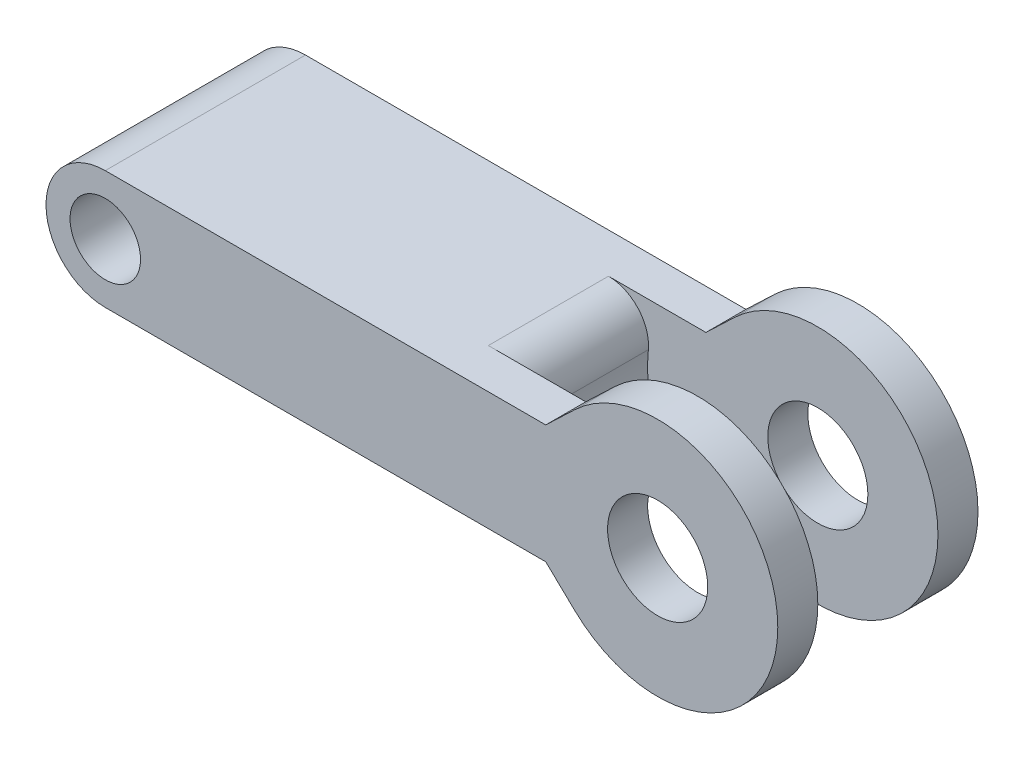
ISO-10303-21;
HEADER;
FILE_DESCRIPTION(('STEP AP214'),'2;1');
FILE_NAME('part.step','',(''),(''),'','','');
FILE_SCHEMA(('AUTOMOTIVE_DESIGN { 1 0 10303 214 1 1 1 1 }'));
ENDSEC;
DATA;
#1=APPLICATION_CONTEXT('core data for automotive mechanical design processes');
#2=APPLICATION_PROTOCOL_DEFINITION('international standard','automotive_design',2000,#1);
#3=PRODUCT_CONTEXT('',#1,'mechanical');
#4=PRODUCT('Part','Part','',(#3));
#5=PRODUCT_RELATED_PRODUCT_CATEGORY('part','',(#4));
#6=PRODUCT_DEFINITION_FORMATION('','',#4);
#7=PRODUCT_DEFINITION_CONTEXT('part definition',#1,'design');
#8=PRODUCT_DEFINITION('design','',#6,#7);
#9=PRODUCT_DEFINITION_SHAPE('','',#8);
#10=(LENGTH_UNIT() NAMED_UNIT(*) SI_UNIT(.MILLI.,.METRE.));
#11=(NAMED_UNIT(*) PLANE_ANGLE_UNIT() SI_UNIT($,.RADIAN.));
#12=(NAMED_UNIT(*) SI_UNIT($,.STERADIAN.) SOLID_ANGLE_UNIT());
#13=UNCERTAINTY_MEASURE_WITH_UNIT(LENGTH_MEASURE(1.E-05),#10,'distance_accuracy_value','');
#14=(GEOMETRIC_REPRESENTATION_CONTEXT(3) GLOBAL_UNCERTAINTY_ASSIGNED_CONTEXT((#13)) GLOBAL_UNIT_ASSIGNED_CONTEXT((#10,
#11,#12)) REPRESENTATION_CONTEXT('',''));
#15=CARTESIAN_POINT('',(0.,0.,0.));
#16=DIRECTION('',(0.,0.,1.));
#17=DIRECTION('',(1.,0.,0.));
#18=AXIS2_PLACEMENT_3D('',#15,#16,#17);
#19=CARTESIAN_POINT('',(-4.14221908071607,4.34073969357202,-5.));
#20=DIRECTION('',(0.690369846786012,-0.723456615595337,0.));
#21=DIRECTION('',(0.723456615595337,0.690369846786012,0.));
#22=AXIS2_PLACEMENT_3D('',#19,#20,#21);
#23=PLANE('',#22);
#24=DIRECTION('',(-0.723456615595337,-0.690369846786012,0.));
#25=VECTOR('',#24,1.);
#26=CARTESIAN_POINT('',(-4.14221908071607,4.34073969357202,-3.));
#27=LINE('',#26,#25);
#28=CARTESIAN_POINT('',(-4.14221908071607,4.34073969357202,-3.));
#29=VERTEX_POINT('',#28);
#30=CARTESIAN_POINT('',(-5.58913231190674,2.96,-3.));
#31=VERTEX_POINT('',#30);
#32=EDGE_CURVE('E207',#29,#31,#27,.T.);
#33=ORIENTED_EDGE('',*,*,#32,.F.);
#34=DIRECTION('',(0.,0.,1.));
#35=VECTOR('',#34,1.);
#36=CARTESIAN_POINT('',(-4.14221908071607,4.34073969357202,-5.));
#37=LINE('',#36,#35);
#38=CARTESIAN_POINT('',(-4.14221908071607,4.34073969357202,-5.));
#39=VERTEX_POINT('',#38);
#40=EDGE_CURVE('E264',#39,#29,#37,.T.);
#41=ORIENTED_EDGE('',*,*,#40,.F.);
#42=DIRECTION('',(0.723456615595337,0.690369846786012,0.));
#43=VECTOR('',#42,1.);
#44=CARTESIAN_POINT('',(-4.14221908071607,4.34073969357202,-5.));
#45=LINE('',#44,#43);
#46=CARTESIAN_POINT('',(-5.58913231190674,2.96,-5.));
#47=VERTEX_POINT('',#46);
#48=EDGE_CURVE('E258',#47,#39,#45,.T.);
#49=ORIENTED_EDGE('',*,*,#48,.F.);
#50=DIRECTION('',(0.,0.,1.));
#51=VECTOR('',#50,1.);
#52=CARTESIAN_POINT('',(-5.58913231190674,2.96,-5.));
#53=LINE('',#52,#51);
#54=EDGE_CURVE('E167',#47,#31,#53,.T.);
#55=ORIENTED_EDGE('',*,*,#54,.T.);
#56=EDGE_LOOP('',(#33,#41,#49,#55));
#57=FACE_BOUND('',#56,.T.);
#58=ADVANCED_FACE('F32',(#57),#23,.F.);
#59=CARTESIAN_POINT('',(0.,0.,-5.));
#60=DIRECTION('',(0.,0.,1.));
#61=DIRECTION('',(1.,0.,0.));
#62=AXIS2_PLACEMENT_3D('',#59,#60,#61);
#63=CYLINDRICAL_SURFACE('',#62,6.);
#64=CARTESIAN_POINT('',(0.,0.,-3.));
#65=DIRECTION('',(0.,0.,1.));
#66=DIRECTION('',(1.,0.,0.));
#67=AXIS2_PLACEMENT_3D('',#64,#65,#66);
#68=CIRCLE('',#67,6.);
#69=CARTESIAN_POINT('',(-4.14221908071606,-4.34073969357203,-3.));
#70=VERTEX_POINT('',#69);
#71=EDGE_CURVE('E147',#70,#29,#68,.T.);
#72=ORIENTED_EDGE('',*,*,#71,.F.);
#73=DIRECTION('',(0.,0.,1.));
#74=VECTOR('',#73,1.);
#75=CARTESIAN_POINT('',(-4.14221908071606,-4.34073969357203,-5.));
#76=LINE('',#75,#74);
#77=CARTESIAN_POINT('',(-4.14221908071606,-4.34073969357203,-5.));
#78=VERTEX_POINT('',#77);
#79=EDGE_CURVE('E146',#78,#70,#76,.T.);
#80=ORIENTED_EDGE('',*,*,#79,.F.);
#81=CARTESIAN_POINT('',(0.,0.,-5.));
#82=DIRECTION('',(0.,0.,1.));
#83=DIRECTION('',(1.,0.,0.));
#84=AXIS2_PLACEMENT_3D('',#81,#82,#83);
#85=CIRCLE('',#84,6.);
#86=EDGE_CURVE('E256',#39,#78,#85,.F.);
#87=ORIENTED_EDGE('',*,*,#86,.F.);
#88=ORIENTED_EDGE('',*,*,#40,.T.);
#89=EDGE_LOOP('',(#72,#80,#87,#88));
#90=FACE_BOUND('',#89,.T.);
#91=ADVANCED_FACE('F302',(#90),#63,.T.);
#92=CARTESIAN_POINT('',(-4.14221908071608,-4.34073969357202,-5.));
#93=DIRECTION('',(0.690369846786013,0.723456615595336,0.));
#94=DIRECTION('',(-0.723456615595336,0.690369846786013,0.));
#95=AXIS2_PLACEMENT_3D('',#92,#93,#94);
#96=PLANE('',#95);
#97=DIRECTION('',(0.723456615595336,-0.690369846786013,0.));
#98=VECTOR('',#97,1.);
#99=CARTESIAN_POINT('',(-4.14221908071608,-4.34073969357202,-3.));
#100=LINE('',#99,#98);
#101=CARTESIAN_POINT('',(-5.58913231190674,-2.96,-3.));
#102=VERTEX_POINT('',#101);
#103=EDGE_CURVE('E132',#102,#70,#100,.T.);
#104=ORIENTED_EDGE('',*,*,#103,.F.);
#105=DIRECTION('',(0.,0.,1.));
#106=VECTOR('',#105,1.);
#107=CARTESIAN_POINT('',(-5.58913231190674,-2.96,-5.));
#108=LINE('',#107,#106);
#109=CARTESIAN_POINT('',(-5.58913231190674,-2.96,-5.));
#110=VERTEX_POINT('',#109);
#111=EDGE_CURVE('E143',#110,#102,#108,.T.);
#112=ORIENTED_EDGE('',*,*,#111,.F.);
#113=DIRECTION('',(-0.723456615595336,0.690369846786013,0.));
#114=VECTOR('',#113,1.);
#115=CARTESIAN_POINT('',(-4.14221908071608,-4.34073969357202,-5.));
#116=LINE('',#115,#114);
#117=EDGE_CURVE('E254',#78,#110,#116,.T.);
#118=ORIENTED_EDGE('',*,*,#117,.F.);
#119=ORIENTED_EDGE('',*,*,#79,.T.);
#120=EDGE_LOOP('',(#104,#112,#118,#119));
#121=FACE_BOUND('',#120,.T.);
#122=ADVANCED_FACE('F141',(#121),#96,.F.);
#123=CARTESIAN_POINT('',(0.,0.,-5.));
#124=DIRECTION('',(0.,0.,1.));
#125=DIRECTION('',(1.,0.,0.));
#126=AXIS2_PLACEMENT_3D('',#123,#124,#125);
#127=CYLINDRICAL_SURFACE('',#126,2.5);
#128=CARTESIAN_POINT('',(0.,0.,-5.));
#129=DIRECTION('',(0.,0.,1.));
#130=DIRECTION('',(1.,0.,0.));
#131=AXIS2_PLACEMENT_3D('',#128,#129,#130);
#132=CIRCLE('',#131,2.5);
#133=CARTESIAN_POINT('',(2.5,0.,-5.));
#134=VERTEX_POINT('',#133);
#135=EDGE_CURVE('E162',#134,#134,#132,.T.);
#136=ORIENTED_EDGE('',*,*,#135,.F.);
#137=EDGE_LOOP('',(#136));
#138=FACE_BOUND('',#137,.T.);
#139=CARTESIAN_POINT('',(0.,0.,-3.));
#140=DIRECTION('',(0.,0.,1.));
#141=DIRECTION('',(1.,0.,0.));
#142=AXIS2_PLACEMENT_3D('',#139,#140,#141);
#143=CIRCLE('',#142,2.5);
#144=CARTESIAN_POINT('',(2.5,0.,-3.));
#145=VERTEX_POINT('',#144);
#146=EDGE_CURVE('E192',#145,#145,#143,.T.);
#147=ORIENTED_EDGE('',*,*,#146,.T.);
#148=EDGE_LOOP('',(#147));
#149=FACE_BOUND('',#148,.T.);
#150=ADVANCED_FACE('F304',(#138,#149),#127,.F.);
#151=CARTESIAN_POINT('',(0.,2.96,-5.));
#152=DIRECTION('',(0.,-1.,0.));
#153=DIRECTION('',(0.,0.,-1.));
#154=AXIS2_PLACEMENT_3D('',#151,#152,#153);
#155=PLANE('',#154);
#156=DIRECTION('',(-1.,0.,0.));
#157=VECTOR('',#156,1.);
#158=CARTESIAN_POINT('',(0.,2.96,3.));
#159=LINE('',#158,#157);
#160=CARTESIAN_POINT('',(-5.58913231190674,2.96,3.));
#161=VERTEX_POINT('',#160);
#162=CARTESIAN_POINT('',(-10.4560221881937,2.96,3.));
#163=VERTEX_POINT('',#162);
#164=EDGE_CURVE('E196',#161,#163,#159,.T.);
#165=ORIENTED_EDGE('',*,*,#164,.T.);
#166=DIRECTION('',(0.,0.,1.));
#167=VECTOR('',#166,1.);
#168=CARTESIAN_POINT('',(-10.4560221881937,2.96,-3.));
#169=LINE('',#168,#167);
#170=CARTESIAN_POINT('',(-10.4560221881937,2.96,-3.));
#171=VERTEX_POINT('',#170);
#172=EDGE_CURVE('E170',#163,#171,#169,.F.);
#173=ORIENTED_EDGE('',*,*,#172,.T.);
#174=DIRECTION('',(-1.,0.,0.));
#175=VECTOR('',#174,1.);
#176=CARTESIAN_POINT('',(0.,2.96,-3.));
#177=LINE('',#176,#175);
#178=EDGE_CURVE('E183',#31,#171,#177,.T.);
#179=ORIENTED_EDGE('',*,*,#178,.F.);
#180=ORIENTED_EDGE('',*,*,#54,.F.);
#181=DIRECTION('',(1.,0.,0.));
#182=VECTOR('',#181,1.);
#183=CARTESIAN_POINT('',(0.,2.96,-5.));
#184=LINE('',#183,#182);
#185=CARTESIAN_POINT('',(-27.5891323119067,2.96,-5.));
#186=VERTEX_POINT('',#185);
#187=EDGE_CURVE('E247',#186,#47,#184,.T.);
#188=ORIENTED_EDGE('',*,*,#187,.F.);
#189=DIRECTION('',(0.,0.,1.));
#190=VECTOR('',#189,1.);
#191=CARTESIAN_POINT('',(-27.5891323119067,2.96,-5.));
#192=LINE('',#191,#190);
#193=CARTESIAN_POINT('',(-27.5891323119067,2.96,5.));
#194=VERTEX_POINT('',#193);
#195=EDGE_CURVE('E160',#186,#194,#192,.T.);
#196=ORIENTED_EDGE('',*,*,#195,.T.);
#197=DIRECTION('',(1.,0.,0.));
#198=VECTOR('',#197,1.);
#199=CARTESIAN_POINT('',(0.,2.96,5.));
#200=LINE('',#199,#198);
#201=CARTESIAN_POINT('',(-5.58913231190674,2.96,5.));
#202=VERTEX_POINT('',#201);
#203=EDGE_CURVE('E223',#194,#202,#200,.T.);
#204=ORIENTED_EDGE('',*,*,#203,.T.);
#205=EDGE_CURVE('E263',#161,#202,#53,.T.);
#206=ORIENTED_EDGE('',*,*,#205,.F.);
#207=EDGE_LOOP('',(#165,#173,#179,#180,#188,#196,#204,#206));
#208=FACE_BOUND('',#207,.T.);
#209=ADVANCED_FACE('F286',(#208),#155,.F.);
#210=CARTESIAN_POINT('',(-4.14221908071607,4.34073969357202,3.));
#211=VERTEX_POINT('',#210);
#212=CARTESIAN_POINT('',(-4.14221908071607,4.34073969357202,5.));
#213=VERTEX_POINT('',#212);
#214=EDGE_CURVE('E266',#211,#213,#37,.T.);
#215=ORIENTED_EDGE('',*,*,#214,.F.);
#216=DIRECTION('',(-0.723456615595337,-0.690369846786012,0.));
#217=VECTOR('',#216,1.);
#218=CARTESIAN_POINT('',(-4.14221908071607,4.34073969357202,3.));
#219=LINE('',#218,#217);
#220=EDGE_CURVE('E217',#211,#161,#219,.T.);
#221=ORIENTED_EDGE('',*,*,#220,.T.);
#222=ORIENTED_EDGE('',*,*,#205,.T.);
#223=DIRECTION('',(0.723456615595337,0.690369846786012,0.));
#224=VECTOR('',#223,1.);
#225=CARTESIAN_POINT('',(-4.14221908071607,4.34073969357202,5.));
#226=LINE('',#225,#224);
#227=EDGE_CURVE('E238',#202,#213,#226,.T.);
#228=ORIENTED_EDGE('',*,*,#227,.T.);
#229=EDGE_LOOP('',(#215,#221,#222,#228));
#230=FACE_BOUND('',#229,.T.);
#231=ADVANCED_FACE('F283',(#230),#23,.F.);
#232=CARTESIAN_POINT('',(-4.14221908071606,-4.34073969357203,3.));
#233=VERTEX_POINT('',#232);
#234=CARTESIAN_POINT('',(-4.14221908071606,-4.34073969357203,5.));
#235=VERTEX_POINT('',#234);
#236=EDGE_CURVE('E152',#233,#235,#76,.T.);
#237=ORIENTED_EDGE('',*,*,#236,.F.);
#238=CARTESIAN_POINT('',(0.,0.,3.));
#239=DIRECTION('',(0.,0.,1.));
#240=DIRECTION('',(1.,0.,0.));
#241=AXIS2_PLACEMENT_3D('',#238,#239,#240);
#242=CIRCLE('',#241,6.);
#243=EDGE_CURVE('E214',#233,#211,#242,.T.);
#244=ORIENTED_EDGE('',*,*,#243,.T.);
#245=ORIENTED_EDGE('',*,*,#214,.T.);
#246=CARTESIAN_POINT('',(0.,0.,5.));
#247=DIRECTION('',(0.,0.,1.));
#248=DIRECTION('',(1.,0.,0.));
#249=AXIS2_PLACEMENT_3D('',#246,#247,#248);
#250=CIRCLE('',#249,6.);
#251=EDGE_CURVE('E235',#213,#235,#250,.F.);
#252=ORIENTED_EDGE('',*,*,#251,.T.);
#253=EDGE_LOOP('',(#237,#244,#245,#252));
#254=FACE_BOUND('',#253,.T.);
#255=ADVANCED_FACE('F274',(#254),#63,.T.);
#256=CARTESIAN_POINT('',(-5.58913231190674,-2.96,3.));
#257=VERTEX_POINT('',#256);
#258=CARTESIAN_POINT('',(-5.58913231190674,-2.96,5.));
#259=VERTEX_POINT('',#258);
#260=EDGE_CURVE('E153',#257,#259,#108,.T.);
#261=ORIENTED_EDGE('',*,*,#260,.F.);
#262=DIRECTION('',(0.723456615595336,-0.690369846786013,0.));
#263=VECTOR('',#262,1.);
#264=CARTESIAN_POINT('',(-4.14221908071608,-4.34073969357202,3.));
#265=LINE('',#264,#263);
#266=EDGE_CURVE('E211',#257,#233,#265,.T.);
#267=ORIENTED_EDGE('',*,*,#266,.T.);
#268=ORIENTED_EDGE('',*,*,#236,.T.);
#269=DIRECTION('',(-0.723456615595336,0.690369846786013,0.));
#270=VECTOR('',#269,1.);
#271=CARTESIAN_POINT('',(-4.14221908071608,-4.34073969357202,5.));
#272=LINE('',#271,#270);
#273=EDGE_CURVE('E232',#235,#259,#272,.T.);
#274=ORIENTED_EDGE('',*,*,#273,.T.);
#275=EDGE_LOOP('',(#261,#267,#268,#274));
#276=FACE_BOUND('',#275,.T.);
#277=ADVANCED_FACE('F292',(#276),#96,.F.);
#278=CARTESIAN_POINT('',(0.,-2.96,-5.));
#279=DIRECTION('',(0.,1.,0.));
#280=DIRECTION('',(-1.,0.,0.));
#281=AXIS2_PLACEMENT_3D('',#278,#279,#280);
#282=PLANE('',#281);
#283=DIRECTION('',(1.,0.,0.));
#284=VECTOR('',#283,1.);
#285=CARTESIAN_POINT('',(0.,-2.96,-3.));
#286=LINE('',#285,#284);
#287=CARTESIAN_POINT('',(-10.4560221881938,-2.96,-3.));
#288=VERTEX_POINT('',#287);
#289=EDGE_CURVE('E47',#288,#102,#286,.T.);
#290=ORIENTED_EDGE('',*,*,#289,.F.);
#291=DIRECTION('',(0.,0.,1.));
#292=VECTOR('',#291,1.);
#293=CARTESIAN_POINT('',(-10.4560221881938,-2.96,3.));
#294=LINE('',#293,#292);
#295=CARTESIAN_POINT('',(-10.4560221881938,-2.96,3.));
#296=VERTEX_POINT('',#295);
#297=EDGE_CURVE('E173',#288,#296,#294,.T.);
#298=ORIENTED_EDGE('',*,*,#297,.T.);
#299=DIRECTION('',(1.,0.,0.));
#300=VECTOR('',#299,1.);
#301=CARTESIAN_POINT('',(0.,-2.96,3.));
#302=LINE('',#301,#300);
#303=EDGE_CURVE('E54',#296,#257,#302,.T.);
#304=ORIENTED_EDGE('',*,*,#303,.T.);
#305=ORIENTED_EDGE('',*,*,#260,.T.);
#306=DIRECTION('',(-1.,0.,0.));
#307=VECTOR('',#306,1.);
#308=CARTESIAN_POINT('',(0.,-2.96,5.));
#309=LINE('',#308,#307);
#310=CARTESIAN_POINT('',(-27.5891323119067,-2.96,5.));
#311=VERTEX_POINT('',#310);
#312=EDGE_CURVE('E229',#259,#311,#309,.T.);
#313=ORIENTED_EDGE('',*,*,#312,.T.);
#314=DIRECTION('',(0.,0.,1.));
#315=VECTOR('',#314,1.);
#316=CARTESIAN_POINT('',(-27.5891323119067,-2.96,-5.));
#317=LINE('',#316,#315);
#318=CARTESIAN_POINT('',(-27.5891323119067,-2.96,-5.));
#319=VERTEX_POINT('',#318);
#320=EDGE_CURVE('E156',#319,#311,#317,.T.);
#321=ORIENTED_EDGE('',*,*,#320,.F.);
#322=DIRECTION('',(-1.,0.,0.));
#323=VECTOR('',#322,1.);
#324=CARTESIAN_POINT('',(0.,-2.96,-5.));
#325=LINE('',#324,#323);
#326=EDGE_CURVE('E151',#110,#319,#325,.T.);
#327=ORIENTED_EDGE('',*,*,#326,.F.);
#328=ORIENTED_EDGE('',*,*,#111,.T.);
#329=EDGE_LOOP('',(#290,#298,#304,#305,#313,#321,#327,#328));
#330=FACE_BOUND('',#329,.T.);
#331=ADVANCED_FACE('F149',(#330),#282,.F.);
#332=CARTESIAN_POINT('',(-27.5891323119067,0.,-5.));
#333=DIRECTION('',(0.,0.,1.));
#334=DIRECTION('',(1.,0.,0.));
#335=AXIS2_PLACEMENT_3D('',#332,#333,#334);
#336=CYLINDRICAL_SURFACE('',#335,2.96);
#337=ORIENTED_EDGE('',*,*,#320,.T.);
#338=CARTESIAN_POINT('',(-27.5891323119067,0.,5.));
#339=DIRECTION('',(0.,0.,1.));
#340=DIRECTION('',(1.,0.,0.));
#341=AXIS2_PLACEMENT_3D('',#338,#339,#340);
#342=CIRCLE('',#341,2.96);
#343=EDGE_CURVE('E226',#194,#311,#342,.T.);
#344=ORIENTED_EDGE('',*,*,#343,.F.);
#345=ORIENTED_EDGE('',*,*,#195,.F.);
#346=CARTESIAN_POINT('',(-27.5891323119067,0.,-5.));
#347=DIRECTION('',(0.,0.,1.));
#348=DIRECTION('',(1.,0.,0.));
#349=AXIS2_PLACEMENT_3D('',#346,#347,#348);
#350=CIRCLE('',#349,2.96);
#351=EDGE_CURVE('E250',#186,#319,#350,.T.);
#352=ORIENTED_EDGE('',*,*,#351,.T.);
#353=EDGE_LOOP('',(#337,#344,#345,#352));
#354=FACE_BOUND('',#353,.T.);
#355=ADVANCED_FACE('F299',(#354),#336,.T.);
#356=CARTESIAN_POINT('',(-27.5891323119067,0.,-5.));
#357=DIRECTION('',(0.,0.,1.));
#358=DIRECTION('',(1.,0.,0.));
#359=AXIS2_PLACEMENT_3D('',#356,#357,#358);
#360=CYLINDRICAL_SURFACE('',#359,1.76);
#361=CARTESIAN_POINT('',(-27.5891323119067,0.,-5.));
#362=DIRECTION('',(0.,0.,1.));
#363=DIRECTION('',(1.,0.,0.));
#364=AXIS2_PLACEMENT_3D('',#361,#362,#363);
#365=CIRCLE('',#364,1.76);
#366=CARTESIAN_POINT('',(-25.8291323119067,0.,-5.));
#367=VERTEX_POINT('',#366);
#368=EDGE_CURVE('E244',#367,#367,#365,.T.);
#369=ORIENTED_EDGE('',*,*,#368,.F.);
#370=EDGE_LOOP('',(#369));
#371=FACE_BOUND('',#370,.T.);
#372=CARTESIAN_POINT('',(-27.5891323119067,0.,5.));
#373=DIRECTION('',(0.,0.,1.));
#374=DIRECTION('',(1.,0.,0.));
#375=AXIS2_PLACEMENT_3D('',#372,#373,#374);
#376=CIRCLE('',#375,1.76);
#377=CARTESIAN_POINT('',(-25.8291323119067,0.,5.));
#378=VERTEX_POINT('',#377);
#379=EDGE_CURVE('E220',#378,#378,#376,.T.);
#380=ORIENTED_EDGE('',*,*,#379,.T.);
#381=EDGE_LOOP('',(#380));
#382=FACE_BOUND('',#381,.T.);
#383=ADVANCED_FACE('F325',(#371,#382),#360,.F.);
#384=CARTESIAN_POINT('',(0.,0.,3.));
#385=DIRECTION('',(0.,0.,1.));
#386=DIRECTION('',(1.,0.,0.));
#387=AXIS2_PLACEMENT_3D('',#384,#385,#386);
#388=CIRCLE('',#387,2.5);
#389=CARTESIAN_POINT('',(2.5,0.,3.));
#390=VERTEX_POINT('',#389);
#391=EDGE_CURVE('E136',#390,#390,#388,.T.);
#392=ORIENTED_EDGE('',*,*,#391,.F.);
#393=EDGE_LOOP('',(#392));
#394=FACE_BOUND('',#393,.T.);
#395=CARTESIAN_POINT('',(0.,0.,5.));
#396=DIRECTION('',(0.,0.,1.));
#397=DIRECTION('',(1.,0.,0.));
#398=AXIS2_PLACEMENT_3D('',#395,#396,#397);
#399=CIRCLE('',#398,2.5);
#400=CARTESIAN_POINT('',(2.5,0.,5.));
#401=VERTEX_POINT('',#400);
#402=EDGE_CURVE('E241',#401,#401,#399,.T.);
#403=ORIENTED_EDGE('',*,*,#402,.T.);
#404=EDGE_LOOP('',(#403));
#405=FACE_BOUND('',#404,.T.);
#406=ADVANCED_FACE('F322',(#394,#405),#127,.F.);
#407=CARTESIAN_POINT('',(0.,0.,-5.));
#408=DIRECTION('',(0.,0.,1.));
#409=DIRECTION('',(1.,0.,0.));
#410=AXIS2_PLACEMENT_3D('',#407,#408,#409);
#411=PLANE('',#410);
#412=ORIENTED_EDGE('',*,*,#368,.T.);
#413=EDGE_LOOP('',(#412));
#414=FACE_BOUND('',#413,.T.);
#415=ORIENTED_EDGE('',*,*,#187,.T.);
#416=ORIENTED_EDGE('',*,*,#48,.T.);
#417=ORIENTED_EDGE('',*,*,#86,.T.);
#418=ORIENTED_EDGE('',*,*,#117,.T.);
#419=ORIENTED_EDGE('',*,*,#326,.T.);
#420=ORIENTED_EDGE('',*,*,#351,.F.);
#421=EDGE_LOOP('',(#415,#416,#417,#418,#419,#420));
#422=FACE_BOUND('',#421,.T.);
#423=ORIENTED_EDGE('',*,*,#135,.T.);
#424=EDGE_LOOP('',(#423));
#425=FACE_BOUND('',#424,.T.);
#426=ADVANCED_FACE('F347',(#414,#422,#425),#411,.F.);
#427=CARTESIAN_POINT('',(0.,0.,5.));
#428=DIRECTION('',(0.,0.,1.));
#429=DIRECTION('',(1.,0.,0.));
#430=AXIS2_PLACEMENT_3D('',#427,#428,#429);
#431=PLANE('',#430);
#432=ORIENTED_EDGE('',*,*,#379,.F.);
#433=EDGE_LOOP('',(#432));
#434=FACE_BOUND('',#433,.T.);
#435=ORIENTED_EDGE('',*,*,#203,.F.);
#436=ORIENTED_EDGE('',*,*,#343,.T.);
#437=ORIENTED_EDGE('',*,*,#312,.F.);
#438=ORIENTED_EDGE('',*,*,#273,.F.);
#439=ORIENTED_EDGE('',*,*,#251,.F.);
#440=ORIENTED_EDGE('',*,*,#227,.F.);
#441=EDGE_LOOP('',(#435,#436,#437,#438,#439,#440));
#442=FACE_BOUND('',#441,.T.);
#443=ORIENTED_EDGE('',*,*,#402,.F.);
#444=EDGE_LOOP('',(#443));
#445=FACE_BOUND('',#444,.T.);
#446=ADVANCED_FACE('F280',(#434,#442,#445),#431,.T.);
#447=CARTESIAN_POINT('',(0.,0.,3.));
#448=DIRECTION('',(0.,0.,-1.));
#449=DIRECTION('',(-1.,0.,0.));
#450=AXIS2_PLACEMENT_3D('',#447,#448,#449);
#451=CYLINDRICAL_SURFACE('',#450,8.5);
#452=CARTESIAN_POINT('',(0.,0.,-3.));
#453=DIRECTION('',(0.,0.,1.));
#454=DIRECTION('',(1.,0.,0.));
#455=AXIS2_PLACEMENT_3D('',#452,#453,#454);
#456=CIRCLE('',#455,8.5);
#457=CARTESIAN_POINT('',(-8.46439891425208,0.777142857142857,-3.));
#458=VERTEX_POINT('',#457);
#459=CARTESIAN_POINT('',(-8.46439891425208,-0.777142857142855,-3.));
#460=VERTEX_POINT('',#459);
#461=EDGE_CURVE('E181',#458,#460,#456,.T.);
#462=ORIENTED_EDGE('',*,*,#461,.F.);
#463=DIRECTION('',(0.,0.,-1.));
#464=VECTOR('',#463,1.);
#465=CARTESIAN_POINT('',(-8.46439891425208,0.777142857142857,3.));
#466=LINE('',#465,#464);
#467=CARTESIAN_POINT('',(-8.46439891425208,0.777142857142857,3.));
#468=VERTEX_POINT('',#467);
#469=EDGE_CURVE('E166',#458,#468,#466,.F.);
#470=ORIENTED_EDGE('',*,*,#469,.T.);
#471=CARTESIAN_POINT('',(0.,0.,3.));
#472=DIRECTION('',(0.,0.,1.));
#473=DIRECTION('',(1.,0.,0.));
#474=AXIS2_PLACEMENT_3D('',#471,#472,#473);
#475=CIRCLE('',#474,8.5);
#476=CARTESIAN_POINT('',(-8.46439891425208,-0.777142857142855,3.));
#477=VERTEX_POINT('',#476);
#478=EDGE_CURVE('E198',#468,#477,#475,.T.);
#479=ORIENTED_EDGE('',*,*,#478,.T.);
#480=DIRECTION('',(0.,0.,-1.));
#481=VECTOR('',#480,1.);
#482=CARTESIAN_POINT('',(-8.46439891425208,-0.777142857142855,3.));
#483=LINE('',#482,#481);
#484=EDGE_CURVE('E163',#477,#460,#483,.T.);
#485=ORIENTED_EDGE('',*,*,#484,.T.);
#486=EDGE_LOOP('',(#462,#470,#479,#485));
#487=FACE_BOUND('',#486,.T.);
#488=ADVANCED_FACE('F188',(#487),#451,.F.);
#489=CARTESIAN_POINT('',(0.,0.,3.));
#490=DIRECTION('',(0.,0.,1.));
#491=DIRECTION('',(1.,0.,0.));
#492=AXIS2_PLACEMENT_3D('',#489,#490,#491);
#493=PLANE('',#492);
#494=ORIENTED_EDGE('',*,*,#391,.T.);
#495=EDGE_LOOP('',(#494));
#496=FACE_BOUND('',#495,.T.);
#497=ORIENTED_EDGE('',*,*,#220,.F.);
#498=ORIENTED_EDGE('',*,*,#243,.F.);
#499=ORIENTED_EDGE('',*,*,#266,.F.);
#500=ORIENTED_EDGE('',*,*,#303,.F.);
#501=CARTESIAN_POINT('',(-10.4560221881938,-0.959999999999998,3.));
#502=DIRECTION('',(0.,0.,1.));
#503=DIRECTION('',(1.,0.,0.));
#504=AXIS2_PLACEMENT_3D('',#501,#502,#503);
#505=CIRCLE('',#504,2.);
#506=EDGE_CURVE('E11',#296,#477,#505,.T.);
#507=ORIENTED_EDGE('',*,*,#506,.T.);
#508=ORIENTED_EDGE('',*,*,#478,.F.);
#509=CARTESIAN_POINT('',(-10.4560221881937,0.96,3.));
#510=DIRECTION('',(0.,0.,1.));
#511=DIRECTION('',(1.,0.,0.));
#512=AXIS2_PLACEMENT_3D('',#509,#510,#511);
#513=CIRCLE('',#512,2.);
#514=EDGE_CURVE('E175',#468,#163,#513,.T.);
#515=ORIENTED_EDGE('',*,*,#514,.T.);
#516=ORIENTED_EDGE('',*,*,#164,.F.);
#517=EDGE_LOOP('',(#497,#498,#499,#500,#507,#508,#515,#516));
#518=FACE_BOUND('',#517,.T.);
#519=ADVANCED_FACE('F195',(#496,#518),#493,.F.);
#520=CARTESIAN_POINT('',(0.,0.,-3.));
#521=DIRECTION('',(0.,0.,1.));
#522=DIRECTION('',(1.,0.,0.));
#523=AXIS2_PLACEMENT_3D('',#520,#521,#522);
#524=PLANE('',#523);
#525=ORIENTED_EDGE('',*,*,#146,.F.);
#526=EDGE_LOOP('',(#525));
#527=FACE_BOUND('',#526,.T.);
#528=ORIENTED_EDGE('',*,*,#178,.T.);
#529=CARTESIAN_POINT('',(-10.4560221881937,0.96,-3.));
#530=DIRECTION('',(0.,0.,1.));
#531=DIRECTION('',(1.,0.,0.));
#532=AXIS2_PLACEMENT_3D('',#529,#530,#531);
#533=CIRCLE('',#532,2.);
#534=EDGE_CURVE('E178',#171,#458,#533,.F.);
#535=ORIENTED_EDGE('',*,*,#534,.T.);
#536=ORIENTED_EDGE('',*,*,#461,.T.);
#537=CARTESIAN_POINT('',(-10.4560221881938,-0.959999999999998,-3.));
#538=DIRECTION('',(0.,0.,1.));
#539=DIRECTION('',(1.,0.,0.));
#540=AXIS2_PLACEMENT_3D('',#537,#538,#539);
#541=CIRCLE('',#540,2.);
#542=EDGE_CURVE('E40',#460,#288,#541,.F.);
#543=ORIENTED_EDGE('',*,*,#542,.T.);
#544=ORIENTED_EDGE('',*,*,#289,.T.);
#545=ORIENTED_EDGE('',*,*,#103,.T.);
#546=ORIENTED_EDGE('',*,*,#71,.T.);
#547=ORIENTED_EDGE('',*,*,#32,.T.);
#548=EDGE_LOOP('',(#528,#535,#536,#543,#544,#545,#546,#547));
#549=FACE_BOUND('',#548,.T.);
#550=ADVANCED_FACE('F131',(#527,#549),#524,.T.);
#551=CARTESIAN_POINT('',(-10.4560221881937,0.96,3.));
#552=DIRECTION('',(0.,0.,-1.));
#553=DIRECTION('',(-1.,0.,0.));
#554=AXIS2_PLACEMENT_3D('',#551,#552,#553);
#555=CYLINDRICAL_SURFACE('',#554,2.);
#556=ORIENTED_EDGE('',*,*,#534,.F.);
#557=ORIENTED_EDGE('',*,*,#172,.F.);
#558=ORIENTED_EDGE('',*,*,#514,.F.);
#559=ORIENTED_EDGE('',*,*,#469,.F.);
#560=EDGE_LOOP('',(#556,#557,#558,#559));
#561=FACE_BOUND('',#560,.T.);
#562=ADVANCED_FACE('F194',(#561),#555,.T.);
#563=CARTESIAN_POINT('',(-10.4560221881938,-0.959999999999998,3.));
#564=DIRECTION('',(0.,0.,-1.));
#565=DIRECTION('',(-1.,0.,0.));
#566=AXIS2_PLACEMENT_3D('',#563,#564,#565);
#567=CYLINDRICAL_SURFACE('',#566,2.);
#568=ORIENTED_EDGE('',*,*,#506,.F.);
#569=ORIENTED_EDGE('',*,*,#297,.F.);
#570=ORIENTED_EDGE('',*,*,#542,.F.);
#571=ORIENTED_EDGE('',*,*,#484,.F.);
#572=EDGE_LOOP('',(#568,#569,#570,#571));
#573=FACE_BOUND('',#572,.T.);
#574=ADVANCED_FACE('F34',(#573),#567,.T.);
#575=CLOSED_SHELL('',(#58,#91,#122,#150,#209,#231,#255,#277,#331,#355,#383,#406,#426,#446,#488,
#519,#550,#562,#574));
#576=MANIFOLD_SOLID_BREP('B2',#575);
#577=ADVANCED_BREP_SHAPE_REPRESENTATION('',(#18,#576),#14);
#578=SHAPE_DEFINITION_REPRESENTATION(#9,#577);
ENDSEC;
END-ISO-10303-21;
